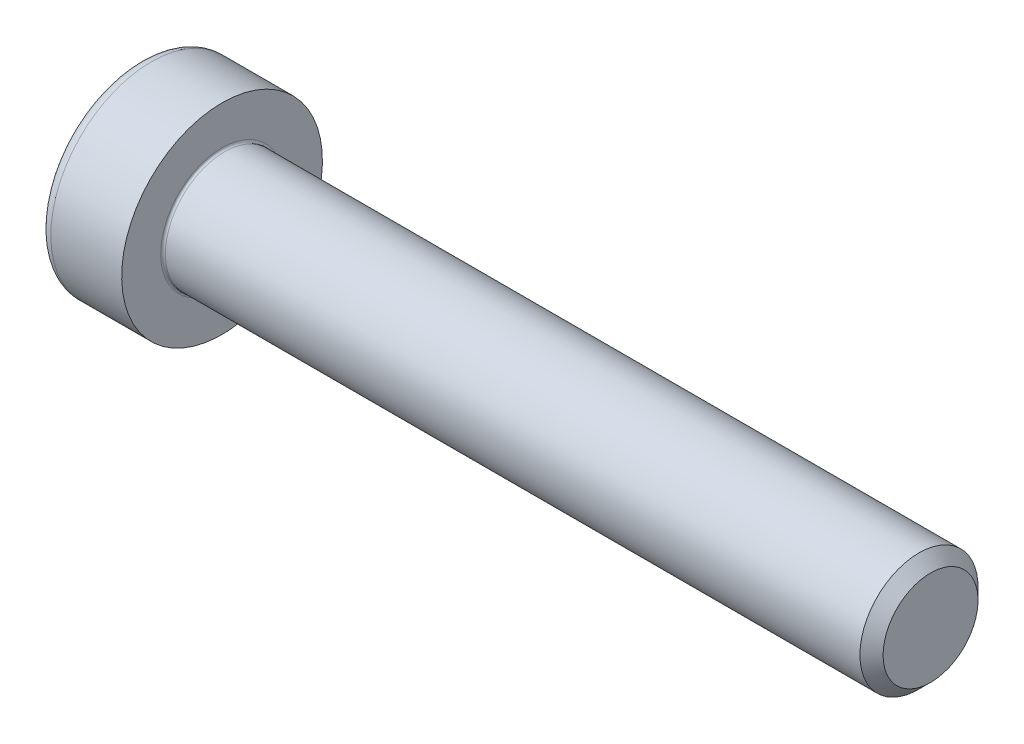
ISO-10303-21;
HEADER;
FILE_DESCRIPTION(('STEP AP214'),'2;1');
FILE_NAME('part.step','',(''),(''),'','','');
FILE_SCHEMA(('AUTOMOTIVE_DESIGN { 1 0 10303 214 1 1 1 1 }'));
ENDSEC;
DATA;
#1=APPLICATION_CONTEXT('core data for automotive mechanical design processes');
#2=APPLICATION_PROTOCOL_DEFINITION('international standard','automotive_design',2000,#1);
#3=PRODUCT_CONTEXT('',#1,'mechanical');
#4=PRODUCT('Part','Part','',(#3));
#5=PRODUCT_RELATED_PRODUCT_CATEGORY('part','',(#4));
#6=PRODUCT_DEFINITION_FORMATION('','',#4);
#7=PRODUCT_DEFINITION_CONTEXT('part definition',#1,'design');
#8=PRODUCT_DEFINITION('design','',#6,#7);
#9=PRODUCT_DEFINITION_SHAPE('','',#8);
#10=(LENGTH_UNIT() NAMED_UNIT(*) SI_UNIT(.MILLI.,.METRE.));
#11=(NAMED_UNIT(*) PLANE_ANGLE_UNIT() SI_UNIT($,.RADIAN.));
#12=(NAMED_UNIT(*) SI_UNIT($,.STERADIAN.) SOLID_ANGLE_UNIT());
#13=UNCERTAINTY_MEASURE_WITH_UNIT(LENGTH_MEASURE(1.E-05),#10,'distance_accuracy_value','');
#14=(GEOMETRIC_REPRESENTATION_CONTEXT(3) GLOBAL_UNCERTAINTY_ASSIGNED_CONTEXT((#13)) GLOBAL_UNIT_ASSIGNED_CONTEXT((#10,
#11,#12)) REPRESENTATION_CONTEXT('',''));
#15=CARTESIAN_POINT('',(0.,0.,0.));
#16=DIRECTION('',(0.,0.,1.));
#17=DIRECTION('',(1.,0.,0.));
#18=AXIS2_PLACEMENT_3D('',#15,#16,#17);
#19=CARTESIAN_POINT('',(-3.5,-1.5,0.866025403784439));
#20=DIRECTION('',(0.,-0.5,0.866025403784439));
#21=DIRECTION('',(0.,-0.866025403784439,-0.5));
#22=AXIS2_PLACEMENT_3D('',#19,#20,#21);
#23=PLANE('',#22);
#24=DIRECTION('',(1.,0.,0.));
#25=VECTOR('',#24,1.);
#26=CARTESIAN_POINT('',(-3.5,-1.5,0.866025403784438));
#27=LINE('',#26,#25);
#28=CARTESIAN_POINT('',(-0.799999985621517,-1.49999995696126,0.866025428632867));
#29=VERTEX_POINT('',#28);
#30=CARTESIAN_POINT('',(-3.5,-1.5,0.866025403784438));
#31=VERTEX_POINT('',#30);
#32=EDGE_CURVE('E80',#29,#31,#27,.F.);
#33=ORIENTED_EDGE('',*,*,#32,.T.);
#34=DIRECTION('',(0.,-0.866025403784439,-0.5));
#35=VECTOR('',#34,1.);
#36=CARTESIAN_POINT('',(-3.5,-1.5,0.866025403784439));
#37=LINE('',#36,#35);
#38=CARTESIAN_POINT('',(-3.5,0.,1.73205080756888));
#39=VERTEX_POINT('',#38);
#40=EDGE_CURVE('E92',#39,#31,#37,.T.);
#41=ORIENTED_EDGE('',*,*,#40,.F.);
#42=DIRECTION('',(1.,0.,0.));
#43=VECTOR('',#42,1.);
#44=CARTESIAN_POINT('',(-3.5,0.,1.73205080756888));
#45=LINE('',#44,#43);
#46=CARTESIAN_POINT('',(-0.799999997599108,7.10597112657267E-09,1.73205080346625));
#47=VERTEX_POINT('',#46);
#48=EDGE_CURVE('E75',#39,#47,#45,.T.);
#49=ORIENTED_EDGE('',*,*,#48,.T.);
#50=CARTESIAN_POINT('',(-0.79999999523045,-1.42119404928174E-08,1.73205079936361));
#51=CARTESIAN_POINT('',(-0.778021654471843,-0.0659159296217276,1.69399422785789));
#52=CARTESIAN_POINT('',(-0.758033503871372,-0.132400830276045,1.65560915256807));
#53=CARTESIAN_POINT('',(-0.723144787463203,-0.26652177314378,1.57817439009942));
#54=CARTESIAN_POINT('',(-0.708256562613244,-0.334160197650861,1.53912332750269));
#55=CARTESIAN_POINT('',(-0.685081967437948,-0.468598837632633,1.46150514251973));
#56=CARTESIAN_POINT('',(-0.676641339355387,-0.535378373795371,1.42294995933982));
#57=CARTESIAN_POINT('',(-0.666566875590513,-0.669251501943529,1.34565827276622));
#58=CARTESIAN_POINT('',(-0.664924695379553,-0.736344607670474,1.306922050114));
#59=CARTESIAN_POINT('',(-0.668349717996232,-0.861700870344839,1.23454757811435));
#60=CARTESIAN_POINT('',(-0.672575963675073,-0.919982838042039,1.20089846837547));
#61=CARTESIAN_POINT('',(-0.685967972738203,-1.0361670854908,1.13381946183533));
#62=CARTESIAN_POINT('',(-0.695138306326933,-1.09406896369226,1.10038979686913));
#63=CARTESIAN_POINT('',(-0.718062365209915,-1.21049256160201,1.03317260127592));
#64=CARTESIAN_POINT('',(-0.731913218733098,-1.26899955377169,0.999393573597279));
#65=CARTESIAN_POINT('',(-0.763348800640084,-1.38514115887701,0.932339186625603));
#66=CARTESIAN_POINT('',(-0.780926147657234,-1.44277725857226,0.899062968951514));
#67=CARTESIAN_POINT('',(-0.799999971937719,-1.49999991590986,0.866025452333902));
#68=B_SPLINE_CURVE_WITH_KNOTS('',3,(#50,#51,#52,#53,#54,#55,#56,#57,#58,#59,#60,#61,#62,#63,#64,
#65,#66,#67),.UNSPECIFIED.,.F.,.F.,(4,2,2,2,2,2,2,2,4),(0.,0.237762007462691,0.476095360319189,
0.708530701230575,0.940680662376142,1.14278080497579,1.34506808554378,1.55184112780972,
1.75820836204339),.UNSPECIFIED.);
#69=EDGE_CURVE('E20',#47,#29,#68,.T.);
#70=ORIENTED_EDGE('',*,*,#69,.T.);
#71=EDGE_LOOP('',(#33,#41,#49,#70));
#72=FACE_BOUND('',#71,.T.);
#73=ADVANCED_FACE('F16',(#72),#23,.F.);
#74=CARTESIAN_POINT('',(-3.5,-1.5,-0.866025403784438));
#75=DIRECTION('',(0.,-1.,0.));
#76=DIRECTION('',(0.,0.,-1.));
#77=AXIS2_PLACEMENT_3D('',#74,#75,#76);
#78=PLANE('',#77);
#79=DIRECTION('',(1.,0.,0.));
#80=VECTOR('',#79,1.);
#81=CARTESIAN_POINT('',(-3.5,-1.5,-0.866025403784441));
#82=LINE('',#81,#80);
#83=CARTESIAN_POINT('',(-0.799999985618855,-1.5,-0.86602535407836));
#84=VERTEX_POINT('',#83);
#85=CARTESIAN_POINT('',(-3.5,-1.5,-0.86602540378444));
#86=VERTEX_POINT('',#85);
#87=EDGE_CURVE('E256',#84,#86,#82,.F.);
#88=ORIENTED_EDGE('',*,*,#87,.T.);
#89=DIRECTION('',(0.,0.,-1.));
#90=VECTOR('',#89,1.);
#91=CARTESIAN_POINT('',(-3.5,-1.5,-0.866025403784438));
#92=LINE('',#91,#90);
#93=EDGE_CURVE('E91',#31,#86,#92,.T.);
#94=ORIENTED_EDGE('',*,*,#93,.F.);
#95=ORIENTED_EDGE('',*,*,#32,.F.);
#96=CARTESIAN_POINT('',(-0.80000001920602,-1.5,0.866025470427717));
#97=CARTESIAN_POINT('',(-0.77802167648586,-1.5,0.789912326041712));
#98=CARTESIAN_POINT('',(-0.758033523800099,-1.5,0.713142174078841));
#99=CARTESIAN_POINT('',(-0.723144803060219,-1.5,0.55827264624065));
#100=CARTESIAN_POINT('',(-0.708256575966329,-1.5,0.480170519528706));
#101=CARTESIAN_POINT('',(-0.685081976340173,-1.5,0.324934146528534));
#102=CARTESIAN_POINT('',(-0.676641346041877,-1.5,0.247823778658389));
#103=CARTESIAN_POINT('',(-0.666566877999725,-1.5,0.0932404023138473));
#104=CARTESIAN_POINT('',(-0.664924695725642,-1.5,0.0157679553227043));
#105=CARTESIAN_POINT('',(-0.668349714916647,-1.5,-0.128980995727346));
#106=CARTESIAN_POINT('',(-0.672575959480197,-1.5,-0.196279220540902));
#107=CARTESIAN_POINT('',(-0.685967967205316,-1.5,-0.330437244310137));
#108=CARTESIAN_POINT('',(-0.695138300573279,-1.5,-0.397296579595575));
#109=CARTESIAN_POINT('',(-0.718062359837834,-1.5,-0.531730981678525));
#110=CARTESIAN_POINT('',(-0.731913213992151,-1.5,-0.599289042575244));
#111=CARTESIAN_POINT('',(-0.763348797819926,-1.5,-0.733397827426864));
#112=CARTESIAN_POINT('',(-0.780926146124088,-1.5,-0.799950268144442));
#113=CARTESIAN_POINT('',(-0.799999971931641,-1.5,-0.86602530666446));
#114=B_SPLINE_CURVE_WITH_KNOTS('',3,(#96,#97,#98,#99,#100,#101,#102,#103,#104,#105,#106,#107,
#108,#109,#110,#111,#112,#113),.UNSPECIFIED.,.F.,.F.,(4,2,2,2,2,2,2,2,4),(0.,0.237762013065174,
0.476095371669085,0.708530717809134,0.940680684129143,1.14278084244057,1.34506813878101,
1.55184119767437,1.75820844842924),.UNSPECIFIED.);
#115=EDGE_CURVE('E85',#29,#84,#114,.T.);
#116=ORIENTED_EDGE('',*,*,#115,.T.);
#117=EDGE_LOOP('',(#88,#94,#95,#116));
#118=FACE_BOUND('',#117,.T.);
#119=ADVANCED_FACE('F89',(#118),#78,.F.);
#120=CARTESIAN_POINT('',(-3.5,0.,1.73205080756888));
#121=DIRECTION('',(0.,0.500000000000001,0.866025403784438));
#122=DIRECTION('',(0.,-0.866025403784438,0.500000000000001));
#123=AXIS2_PLACEMENT_3D('',#120,#121,#122);
#124=PLANE('',#123);
#125=ORIENTED_EDGE('',*,*,#48,.F.);
#126=DIRECTION('',(0.,-0.866025403784438,0.500000000000001));
#127=VECTOR('',#126,1.);
#128=CARTESIAN_POINT('',(-3.5,0.,1.73205080756888));
#129=LINE('',#128,#127);
#130=CARTESIAN_POINT('',(-3.5,1.5,0.866025403784438));
#131=VERTEX_POINT('',#130);
#132=EDGE_CURVE('E264',#131,#39,#129,.T.);
#133=ORIENTED_EDGE('',*,*,#132,.F.);
#134=DIRECTION('',(1.,0.,0.));
#135=VECTOR('',#134,1.);
#136=CARTESIAN_POINT('',(-3.5,1.5,0.866025403784437));
#137=LINE('',#136,#135);
#138=CARTESIAN_POINT('',(-0.799999985617244,1.5,0.866025354072781));
#139=VERTEX_POINT('',#138);
#140=EDGE_CURVE('E86',#131,#139,#137,.T.);
#141=ORIENTED_EDGE('',*,*,#140,.T.);
#142=CARTESIAN_POINT('',(-0.800000019194172,1.50000005767922,0.866025370483324));
#143=CARTESIAN_POINT('',(-0.778021676467504,1.43408414105691,0.904081942689099));
#144=CARTESIAN_POINT('',(-0.758033523776554,1.36759923918227,0.942467018683468));
#145=CARTESIAN_POINT('',(-0.723144803029528,1.23347829375395,1.01990178263048));
#146=CARTESIAN_POINT('',(-0.708256575933912,1.16583986790583,1.05895284600145));
#147=CARTESIAN_POINT('',(-0.685081976318737,1.03140122529361,1.13657103250311));
#148=CARTESIAN_POINT('',(-0.676641346028541,0.964621687846786,1.17512621642439));
#149=CARTESIAN_POINT('',(-0.666566877996918,0.830748556981707,1.2524179045666));
#150=CARTESIAN_POINT('',(-0.664924695725045,0.76365544982222,1.2911541280459));
#151=CARTESIAN_POINT('',(-0.668349715080408,0.638299175166305,1.3635286069631));
#152=CARTESIAN_POINT('',(-0.672575960340761,0.580017196957215,1.39717772277102));
#153=CARTESIAN_POINT('',(-0.68596797041692,0.463832928567564,1.46425674140138));
#154=CARTESIAN_POINT('',(-0.69513830544139,0.405931039937444,1.49768641238857));
#155=CARTESIAN_POINT('',(-0.718062368835887,0.2895074208714,1.56490362019638));
#156=CARTESIAN_POINT('',(-0.73191322549354,0.231000417983331,1.59868265406329));
#157=CARTESIAN_POINT('',(-0.763348814872164,0.114858791804426,1.6657370532018));
#158=CARTESIAN_POINT('',(-0.780926166220527,0.0572226817527214,1.69901327685519));
#159=CARTESIAN_POINT('',(-0.799999995230451,1.42119421439077E-08,1.73205079936361));
#160=B_SPLINE_CURVE_WITH_KNOTS('',3,(#142,#143,#144,#145,#146,#147,#148,#149,#150,#151,#152,
#153,#154,#155,#156,#157,#158,#159),.UNSPECIFIED.,.F.,.F.,(4,2,2,2,2,2,2,2,4),(0.,
0.237762013144064,0.476095371837281,0.70853071789167,0.940680684118433,1.14278086286583,
1.34506817971784,1.55184126018789,1.75820853235518),.UNSPECIFIED.);
#161=EDGE_CURVE('E124',#139,#47,#160,.T.);
#162=ORIENTED_EDGE('',*,*,#161,.T.);
#163=EDGE_LOOP('',(#125,#133,#141,#162));
#164=FACE_BOUND('',#163,.T.);
#165=ADVANCED_FACE('F117',(#164),#124,.F.);
#166=CARTESIAN_POINT('',(-3.5,0.,-1.73205080756888));
#167=DIRECTION('',(0.,-0.5,-0.866025403784439));
#168=DIRECTION('',(0.,0.866025403784439,-0.5));
#169=AXIS2_PLACEMENT_3D('',#166,#167,#168);
#170=PLANE('',#169);
#171=DIRECTION('',(1.,0.,0.));
#172=VECTOR('',#171,1.);
#173=CARTESIAN_POINT('',(-3.5,0.,-1.73205080756888));
#174=LINE('',#173,#172);
#175=CARTESIAN_POINT('',(-0.79999999228092,-5.19199613852355E-08,-1.73205079425487));
#176=VERTEX_POINT('',#175);
#177=CARTESIAN_POINT('',(-3.5,0.,-1.73205080756888));
#178=VERTEX_POINT('',#177);
#179=EDGE_CURVE('E130',#176,#178,#174,.F.);
#180=ORIENTED_EDGE('',*,*,#179,.T.);
#181=DIRECTION('',(0.,0.866025403784439,-0.5));
#182=VECTOR('',#181,1.);
#183=CARTESIAN_POINT('',(-3.5,0.,-1.73205080756888));
#184=LINE('',#183,#182);
#185=EDGE_CURVE('E40',#86,#178,#184,.T.);
#186=ORIENTED_EDGE('',*,*,#185,.F.);
#187=ORIENTED_EDGE('',*,*,#87,.F.);
#188=CARTESIAN_POINT('',(-0.800000019198761,-1.50000005769299,-0.866025370475378));
#189=CARTESIAN_POINT('',(-0.778021676478219,-1.43408414109019,-0.904081942669885));
#190=CARTESIAN_POINT('',(-0.758033523792277,-1.36759923923531,-0.942467018652845));
#191=CARTESIAN_POINT('',(-0.723144803052496,-1.23347829384962,-1.01990178257524));
#192=CARTESIAN_POINT('',(-0.708256575958915,-1.16583986802441,-1.05895284593299));
#193=CARTESIAN_POINT('',(-0.685081976335254,-1.03140122541517,-1.13657103243292));
#194=CARTESIAN_POINT('',(-0.676641346038544,-0.964621687947897,-1.17512621636601));
#195=CARTESIAN_POINT('',(-0.666566877998786,-0.830748557038212,-1.25241790453398));
#196=CARTESIAN_POINT('',(-0.664924695725483,-0.763655449854568,-1.29115412802722));
#197=CARTESIAN_POINT('',(-0.668349714938769,-0.638299180308248,-1.3635286039944));
#198=CARTESIAN_POINT('',(-0.672575959593581,-0.580017207221903,-1.3971777168447));
#199=CARTESIAN_POINT('',(-0.685967967626045,-0.463832948992604,-1.46425672960898));
#200=CARTESIAN_POINT('',(-0.695138301210386,-0.405931065399888,-1.49768639768782));
#201=CARTESIAN_POINT('',(-0.718062361014187,-0.289507456525243,-1.56490359961163));
#202=CARTESIAN_POINT('',(-0.731913215495269,-0.231000458786165,-1.59868263050576));
#203=CARTESIAN_POINT('',(-0.763348800047481,-0.114858842717895,-1.66573702380689));
#204=CARTESIAN_POINT('',(-0.780926148748883,-0.0572227376285118,-1.69901324459529));
#205=CARTESIAN_POINT('',(-0.799999974974276,-7.49804692458818E-08,-1.73205076427889));
#206=B_SPLINE_CURVE_WITH_KNOTS('',3,(#188,#189,#190,#191,#192,#193,#194,#195,#196,#197,#198,
#199,#200,#201,#202,#203,#204,#205),.UNSPECIFIED.,.F.,.F.,(4,2,2,2,2,2,2,2,4),(0.,
0.237762013074141,0.476095371688346,0.708530717815963,0.940680684122562,1.14278084509902,
1.34506814411434,1.55184120582147,1.75820845936869),.UNSPECIFIED.);
#207=EDGE_CURVE('E98',#84,#176,#206,.T.);
#208=ORIENTED_EDGE('',*,*,#207,.T.);
#209=EDGE_LOOP('',(#180,#186,#187,#208));
#210=FACE_BOUND('',#209,.T.);
#211=ADVANCED_FACE('F120',(#210),#170,.F.);
#212=CARTESIAN_POINT('',(-3.5,1.5,0.866025403784437));
#213=DIRECTION('',(0.,1.,0.));
#214=DIRECTION('',(0.,0.,1.));
#215=AXIS2_PLACEMENT_3D('',#212,#213,#214);
#216=PLANE('',#215);
#217=ORIENTED_EDGE('',*,*,#140,.F.);
#218=DIRECTION('',(0.,0.,1.));
#219=VECTOR('',#218,1.);
#220=CARTESIAN_POINT('',(-3.5,1.5,0.866025403784437));
#221=LINE('',#220,#219);
#222=CARTESIAN_POINT('',(-3.5,1.5,-0.86602540378444));
#223=VERTEX_POINT('',#222);
#224=EDGE_CURVE('E246',#223,#131,#221,.T.);
#225=ORIENTED_EDGE('',*,*,#224,.F.);
#226=DIRECTION('',(1.,0.,0.));
#227=VECTOR('',#226,1.);
#228=CARTESIAN_POINT('',(-3.5,1.5,-0.86602540378444));
#229=LINE('',#228,#227);
#230=CARTESIAN_POINT('',(-0.800000004777985,1.5,-0.866025420447538));
#231=VERTEX_POINT('',#230);
#232=EDGE_CURVE('E233',#223,#231,#229,.T.);
#233=ORIENTED_EDGE('',*,*,#232,.T.);
#234=CARTESIAN_POINT('',(-0.800000009591057,1.49999999999528,-0.866025437109814));
#235=CARTESIAN_POINT('',(-0.77802166765586,1.4999999999983,-0.789912293275434));
#236=CARTESIAN_POINT('',(-0.7580335158058,1.49999999999954,-0.713142141867382));
#237=CARTESIAN_POINT('',(-0.723144796802962,1.50000000000045,-0.558272615192525));
#238=CARTESIAN_POINT('',(-0.708256570609415,1.50000000000012,-0.480170489089434));
#239=CARTESIAN_POINT('',(-0.685081972768887,1.49999999999988,-0.324934117305971));
#240=CARTESIAN_POINT('',(-0.676641343359413,1.49999999999997,-0.247823750041499));
#241=CARTESIAN_POINT('',(-0.666566877033156,1.50000000000003,-0.0932403749791662));
#242=CARTESIAN_POINT('',(-0.664924695586781,1.50000000000001,-0.0157679286644264));
#243=CARTESIAN_POINT('',(-0.66834971615212,1.49999999999999,0.128981019555387));
#244=CARTESIAN_POINT('',(-0.672575961162931,1.5,0.196279242226448));
#245=CARTESIAN_POINT('',(-0.685967969424226,1.5,0.330437261703751));
#246=CARTESIAN_POINT('',(-0.69513830288032,1.5,0.397296594839799));
#247=CARTESIAN_POINT('',(-0.718062361990699,1.5,0.53173099254756));
#248=CARTESIAN_POINT('',(-0.731913215891151,1.5,0.599289051220097));
#249=CARTESIAN_POINT('',(-0.763348798946861,1.5,0.733397831691883));
#250=CARTESIAN_POINT('',(-0.780926146733885,1.5,0.799950270253574));
#251=CARTESIAN_POINT('',(-0.79999997192795,1.5,0.866025306651675));
#252=B_SPLINE_CURVE_WITH_KNOTS('',3,(#234,#235,#236,#237,#238,#239,#240,#241,#242,#243,#244,
#245,#246,#247,#248,#249,#250,#251),.UNSPECIFIED.,.F.,.F.,(4,2,2,2,2,2,2,2,4),(0.,
0.237762010818538,0.47609536711758,0.708530711160745,0.94068067540566,1.1427808274082,
1.34506811741536,1.55184116963225,1.75820841375334),.UNSPECIFIED.);
#253=EDGE_CURVE('E99',#231,#139,#252,.T.);
#254=ORIENTED_EDGE('',*,*,#253,.T.);
#255=EDGE_LOOP('',(#217,#225,#233,#254));
#256=FACE_BOUND('',#255,.T.);
#257=ADVANCED_FACE('F142',(#256),#216,.F.);
#258=CARTESIAN_POINT('',(-0.805999999954565,0.,0.));
#259=DIRECTION('',(-1.,0.,0.));
#260=DIRECTION('',(0.,0.,1.));
#261=AXIS2_PLACEMENT_3D('',#258,#259,#260);
#262=CONICAL_SURFACE('',#261,1.74244311239136,1.04719755119347);
#263=CARTESIAN_POINT('',(0.200000000006639,5.6843418860808E-11,0.));
#264=VERTEX_POINT('',#263);
#265=VERTEX_LOOP('',#264);
#266=FACE_BOUND('',#265,.T.);
#267=ORIENTED_EDGE('',*,*,#253,.F.);
#268=CARTESIAN_POINT('',(-0.799999987556277,1.4999999983015,-0.866025421417545));
#269=CARTESIAN_POINT('',(-0.778021652561019,1.43408407762367,-0.904081985293118));
#270=CARTESIAN_POINT('',(-0.758033504355957,1.36759917518167,-0.942467057237193));
#271=CARTESIAN_POINT('',(-0.723144789667161,1.2334782317236,-1.0199018168369));
#272=CARTESIAN_POINT('',(-0.708256564140513,1.16583980841997,-1.05895287992025));
#273=CARTESIAN_POINT('',(-0.685081968277753,1.03140116995701,-1.13657106486655));
#274=CARTESIAN_POINT('',(-0.676641340171634,0.964621634129466,-1.17512624754868));
#275=CARTESIAN_POINT('',(-0.666566876036259,0.830748506890652,-1.25241793337623));
#276=CARTESIAN_POINT('',(-0.664924695474878,0.763655401737834,-1.29115415577973));
#277=CARTESIAN_POINT('',(-0.668349717700705,0.638299129217241,-1.36352863351591));
#278=CARTESIAN_POINT('',(-0.672575964320051,0.580017151133725,-1.39717774923372));
#279=CARTESIAN_POINT('',(-0.685967976966546,0.463832883061417,-1.46425676766786));
#280=CARTESIAN_POINT('',(-0.695138313203807,0.405930994623284,-1.49768643854884));
#281=CARTESIAN_POINT('',(-0.718062378844431,0.289507376074144,-1.56490364606201));
#282=CARTESIAN_POINT('',(-0.731913236524033,0.231000373510667,-1.59868267974055));
#283=CARTESIAN_POINT('',(-0.763348827728675,0.114858748018946,-1.6657370784804));
#284=CARTESIAN_POINT('',(-0.780926179879473,0.0572226383294093,-1.69901330192374));
#285=CARTESIAN_POINT('',(-0.800000009587573,-2.88594274400154E-08,-1.73205082423088));
#286=B_SPLINE_CURVE_WITH_KNOTS('',3,(#268,#269,#270,#271,#272,#273,#274,#275,#276,#277,#278,
#279,#280,#281,#282,#283,#284,#285),.UNSPECIFIED.,.F.,.F.,(4,2,2,2,2,2,2,2,4),(0.,
0.237762005315108,0.476095356328078,0.708530695574836,0.940680654925048,1.14278083346443,
1.34506815017324,1.55184123016706,1.7582085017467),.UNSPECIFIED.);
#287=EDGE_CURVE('E131',#231,#176,#286,.T.);
#288=ORIENTED_EDGE('',*,*,#287,.T.);
#289=ORIENTED_EDGE('',*,*,#207,.F.);
#290=ORIENTED_EDGE('',*,*,#115,.F.);
#291=ORIENTED_EDGE('',*,*,#69,.F.);
#292=ORIENTED_EDGE('',*,*,#161,.F.);
#293=EDGE_LOOP('',(#267,#288,#289,#290,#291,#292));
#294=FACE_BOUND('',#293,.T.);
#295=ADVANCED_FACE('F96',(#266,#294),#262,.F.);
#296=CARTESIAN_POINT('',(-3.5,1.5,-0.86602540378444));
#297=DIRECTION('',(0.,0.5,-0.866025403784439));
#298=DIRECTION('',(0.,0.866025403784439,0.5));
#299=AXIS2_PLACEMENT_3D('',#296,#297,#298);
#300=PLANE('',#299);
#301=ORIENTED_EDGE('',*,*,#232,.F.);
#302=DIRECTION('',(0.,0.866025403784438,0.5));
#303=VECTOR('',#302,1.);
#304=CARTESIAN_POINT('',(-3.5,0.,-1.73205080756888));
#305=LINE('',#304,#303);
#306=EDGE_CURVE('E252',#178,#223,#305,.T.);
#307=ORIENTED_EDGE('',*,*,#306,.F.);
#308=ORIENTED_EDGE('',*,*,#179,.F.);
#309=ORIENTED_EDGE('',*,*,#287,.F.);
#310=EDGE_LOOP('',(#301,#307,#308,#309));
#311=FACE_BOUND('',#310,.T.);
#312=ADVANCED_FACE('F151',(#311),#300,.F.);
#313=CARTESIAN_POINT('',(-3.5,2.99102540378444,0.));
#314=DIRECTION('',(-1.,0.,0.));
#315=DIRECTION('',(0.,-1.,0.));
#316=AXIS2_PLACEMENT_3D('',#313,#314,#315);
#317=PLANE('',#316);
#318=ORIENTED_EDGE('',*,*,#185,.T.);
#319=ORIENTED_EDGE('',*,*,#306,.T.);
#320=ORIENTED_EDGE('',*,*,#224,.T.);
#321=ORIENTED_EDGE('',*,*,#132,.T.);
#322=ORIENTED_EDGE('',*,*,#40,.T.);
#323=ORIENTED_EDGE('',*,*,#93,.T.);
#324=EDGE_LOOP('',(#318,#319,#320,#321,#322,#323));
#325=FACE_BOUND('',#324,.T.);
#326=CARTESIAN_POINT('',(-3.5,0.,0.));
#327=DIRECTION('',(1.,0.,0.));
#328=DIRECTION('',(0.,1.,0.));
#329=AXIS2_PLACEMENT_3D('',#326,#327,#328);
#330=CIRCLE('',#329,3.75);
#331=CARTESIAN_POINT('',(-3.5,3.75,0.));
#332=VERTEX_POINT('',#331);
#333=EDGE_CURVE('E220',#332,#332,#330,.T.);
#334=ORIENTED_EDGE('',*,*,#333,.F.);
#335=EDGE_LOOP('',(#334));
#336=FACE_BOUND('',#335,.T.);
#337=ADVANCED_FACE('F207',(#325,#336),#317,.T.);
#338=CARTESIAN_POINT('',(-3.,0.,0.));
#339=DIRECTION('',(1.,0.,0.));
#340=DIRECTION('',(0.,0.,-1.));
#341=AXIS2_PLACEMENT_3D('',#338,#339,#340);
#342=TOROIDAL_SURFACE('',#341,3.75,0.5);
#343=CARTESIAN_POINT('',(-3.,0.,0.));
#344=DIRECTION('',(1.,0.,0.));
#345=DIRECTION('',(0.,1.,0.));
#346=AXIS2_PLACEMENT_3D('',#343,#344,#345);
#347=CIRCLE('',#346,4.25);
#348=CARTESIAN_POINT('',(-3.,4.25,0.));
#349=VERTEX_POINT('',#348);
#350=EDGE_CURVE('E285',#349,#349,#347,.T.);
#351=ORIENTED_EDGE('',*,*,#350,.F.);
#352=EDGE_LOOP('',(#351));
#353=FACE_BOUND('',#352,.T.);
#354=ORIENTED_EDGE('',*,*,#333,.T.);
#355=EDGE_LOOP('',(#354));
#356=FACE_BOUND('',#355,.T.);
#357=ADVANCED_FACE('F201',(#353,#356),#342,.T.);
#358=CARTESIAN_POINT('',(-1.75,0.,0.));
#359=DIRECTION('',(1.,0.,0.));
#360=DIRECTION('',(0.,1.,0.));
#361=AXIS2_PLACEMENT_3D('',#358,#359,#360);
#362=CYLINDRICAL_SURFACE('',#361,4.25);
#363=ORIENTED_EDGE('',*,*,#350,.T.);
#364=EDGE_LOOP('',(#363));
#365=FACE_BOUND('',#364,.T.);
#366=CARTESIAN_POINT('',(0.,0.,0.));
#367=DIRECTION('',(1.,0.,0.));
#368=DIRECTION('',(0.,1.,0.));
#369=AXIS2_PLACEMENT_3D('',#366,#367,#368);
#370=CIRCLE('',#369,4.25);
#371=CARTESIAN_POINT('',(0.,4.25,0.));
#372=VERTEX_POINT('',#371);
#373=EDGE_CURVE('E281',#372,#372,#370,.T.);
#374=ORIENTED_EDGE('',*,*,#373,.F.);
#375=EDGE_LOOP('',(#374));
#376=FACE_BOUND('',#375,.T.);
#377=ADVANCED_FACE('F197',(#365,#376),#362,.T.);
#378=CARTESIAN_POINT('',(30.,1.25,0.));
#379=DIRECTION('',(1.,0.,0.));
#380=DIRECTION('',(0.,1.,0.));
#381=AXIS2_PLACEMENT_3D('',#378,#379,#380);
#382=PLANE('',#381);
#383=CARTESIAN_POINT('',(29.9999999999727,0.,0.));
#384=DIRECTION('',(-1.,0.,0.));
#385=DIRECTION('',(0.,0.,1.));
#386=AXIS2_PLACEMENT_3D('',#383,#384,#385);
#387=CIRCLE('',#386,2.00924000000668);
#388=CARTESIAN_POINT('',(29.9999999999727,0.,2.00924000000668));
#389=VERTEX_POINT('',#388);
#390=EDGE_CURVE('E278',#389,#389,#387,.T.);
#391=ORIENTED_EDGE('',*,*,#390,.F.);
#392=EDGE_LOOP('',(#391));
#393=FACE_BOUND('',#392,.T.);
#394=ADVANCED_FACE('F194',(#393),#382,.T.);
#395=CARTESIAN_POINT('',(0.,3.375,0.));
#396=DIRECTION('',(1.,0.,0.));
#397=DIRECTION('',(0.,1.,0.));
#398=AXIS2_PLACEMENT_3D('',#395,#396,#397);
#399=PLANE('',#398);
#400=CARTESIAN_POINT('',(0.,0.,0.));
#401=DIRECTION('',(1.,0.,0.));
#402=DIRECTION('',(0.,1.,0.));
#403=AXIS2_PLACEMENT_3D('',#400,#401,#402);
#404=CIRCLE('',#403,2.6);
#405=CARTESIAN_POINT('',(0.,2.6,0.));
#406=VERTEX_POINT('',#405);
#407=EDGE_CURVE('E181',#406,#406,#404,.F.);
#408=ORIENTED_EDGE('',*,*,#407,.T.);
#409=EDGE_LOOP('',(#408));
#410=FACE_BOUND('',#409,.T.);
#411=ORIENTED_EDGE('',*,*,#373,.T.);
#412=EDGE_LOOP('',(#411));
#413=FACE_BOUND('',#412,.T.);
#414=ADVANCED_FACE('F185',(#410,#413),#399,.T.);
#415=CARTESIAN_POINT('',(29.5092399999817,0.,0.));
#416=DIRECTION('',(-1.,0.,0.));
#417=DIRECTION('',(0.,0.,1.));
#418=AXIS2_PLACEMENT_3D('',#415,#416,#417);
#419=CONICAL_SURFACE('',#418,2.50000000005457,0.785398163455362);
#420=ORIENTED_EDGE('',*,*,#390,.T.);
#421=EDGE_LOOP('',(#420));
#422=FACE_BOUND('',#421,.T.);
#423=CARTESIAN_POINT('',(29.50924,0.,0.));
#424=DIRECTION('',(1.,0.,0.));
#425=DIRECTION('',(0.,1.,0.));
#426=AXIS2_PLACEMENT_3D('',#423,#424,#425);
#427=CIRCLE('',#426,2.5);
#428=CARTESIAN_POINT('',(29.50924,2.5,0.));
#429=VERTEX_POINT('',#428);
#430=EDGE_CURVE('E31',#429,#429,#427,.F.);
#431=ORIENTED_EDGE('',*,*,#430,.F.);
#432=EDGE_LOOP('',(#431));
#433=FACE_BOUND('',#432,.T.);
#434=ADVANCED_FACE('F163',(#422,#433),#419,.T.);
#435=CARTESIAN_POINT('',(0.100000000000002,0.,0.));
#436=DIRECTION('',(1.,0.,0.));
#437=DIRECTION('',(0.,0.,-1.));
#438=AXIS2_PLACEMENT_3D('',#435,#436,#437);
#439=TOROIDAL_SURFACE('',#438,2.6,0.1);
#440=CARTESIAN_POINT('',(0.100000000000003,0.,0.));
#441=DIRECTION('',(1.,0.,0.));
#442=DIRECTION('',(0.,1.,0.));
#443=AXIS2_PLACEMENT_3D('',#440,#441,#442);
#444=CIRCLE('',#443,2.5);
#445=CARTESIAN_POINT('',(0.100000000000003,2.5,0.));
#446=VERTEX_POINT('',#445);
#447=EDGE_CURVE('E11',#446,#446,#444,.T.);
#448=ORIENTED_EDGE('',*,*,#447,.F.);
#449=EDGE_LOOP('',(#448));
#450=FACE_BOUND('',#449,.T.);
#451=ORIENTED_EDGE('',*,*,#407,.F.);
#452=EDGE_LOOP('',(#451));
#453=FACE_BOUND('',#452,.T.);
#454=ADVANCED_FACE('F157',(#450,#453),#439,.F.);
#455=CARTESIAN_POINT('',(22.,0.,0.));
#456=DIRECTION('',(1.,0.,0.));
#457=DIRECTION('',(0.,1.,0.));
#458=AXIS2_PLACEMENT_3D('',#455,#456,#457);
#459=CYLINDRICAL_SURFACE('',#458,2.5);
#460=ORIENTED_EDGE('',*,*,#447,.T.);
#461=EDGE_LOOP('',(#460));
#462=FACE_BOUND('',#461,.T.);
#463=ORIENTED_EDGE('',*,*,#430,.T.);
#464=EDGE_LOOP('',(#463));
#465=FACE_BOUND('',#464,.T.);
#466=ADVANCED_FACE('F155',(#462,#465),#459,.T.);
#467=CLOSED_SHELL('',(#73,#119,#165,#211,#257,#295,#312,#337,#357,#377,#394,#414,#434,#454,#466));
#468=MANIFOLD_SOLID_BREP('B1',#467);
#469=ADVANCED_BREP_SHAPE_REPRESENTATION('',(#18,#468),#14);
#470=SHAPE_DEFINITION_REPRESENTATION(#9,#469);
ENDSEC;
END-ISO-10303-21;
